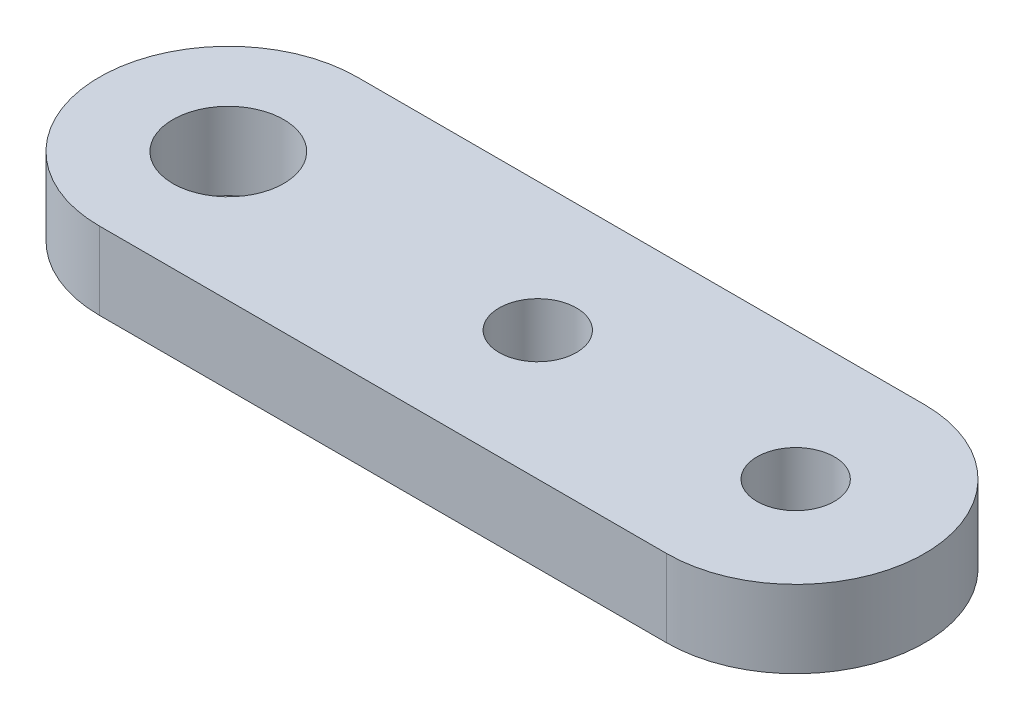
ISO-10303-21;
HEADER;
FILE_DESCRIPTION(('STEP AP214'),'2;1');
FILE_NAME('part.step','',(''),(''),'','','');
FILE_SCHEMA(('AUTOMOTIVE_DESIGN { 1 0 10303 214 1 1 1 1 }'));
ENDSEC;
DATA;
#1=APPLICATION_CONTEXT('core data for automotive mechanical design processes');
#2=APPLICATION_PROTOCOL_DEFINITION('international standard','automotive_design',2000,#1);
#3=PRODUCT_CONTEXT('',#1,'mechanical');
#4=PRODUCT('Part','Part','',(#3));
#5=PRODUCT_RELATED_PRODUCT_CATEGORY('part','',(#4));
#6=PRODUCT_DEFINITION_FORMATION('','',#4);
#7=PRODUCT_DEFINITION_CONTEXT('part definition',#1,'design');
#8=PRODUCT_DEFINITION('design','',#6,#7);
#9=PRODUCT_DEFINITION_SHAPE('','',#8);
#10=(LENGTH_UNIT() NAMED_UNIT(*) SI_UNIT(.MILLI.,.METRE.));
#11=(NAMED_UNIT(*) PLANE_ANGLE_UNIT() SI_UNIT($,.RADIAN.));
#12=(NAMED_UNIT(*) SI_UNIT($,.STERADIAN.) SOLID_ANGLE_UNIT());
#13=UNCERTAINTY_MEASURE_WITH_UNIT(LENGTH_MEASURE(1.E-05),#10,'distance_accuracy_value','');
#14=(GEOMETRIC_REPRESENTATION_CONTEXT(3) GLOBAL_UNCERTAINTY_ASSIGNED_CONTEXT((#13)) GLOBAL_UNIT_ASSIGNED_CONTEXT((#10,
#11,#12)) REPRESENTATION_CONTEXT('',''));
#15=CARTESIAN_POINT('',(0.,0.,0.));
#16=DIRECTION('',(0.,0.,1.));
#17=DIRECTION('',(1.,0.,0.));
#18=AXIS2_PLACEMENT_3D('',#15,#16,#17);
#19=CARTESIAN_POINT('',(-22.,3.,0.));
#20=DIRECTION('',(0.,1.,0.));
#21=DIRECTION('',(0.,0.,1.));
#22=AXIS2_PLACEMENT_3D('',#19,#20,#21);
#23=PLANE('',#22);
#24=CARTESIAN_POINT('',(-10.,3.,0.));
#25=DIRECTION('',(0.,1.,0.));
#26=DIRECTION('',(0.,0.,1.));
#27=AXIS2_PLACEMENT_3D('',#24,#25,#26);
#28=CIRCLE('',#27,1.5);
#29=CARTESIAN_POINT('',(-10.,3.,1.5));
#30=VERTEX_POINT('',#29);
#31=EDGE_CURVE('E118',#30,#30,#28,.T.);
#32=ORIENTED_EDGE('',*,*,#31,.F.);
#33=EDGE_LOOP('',(#32));
#34=FACE_BOUND('',#33,.T.);
#35=CARTESIAN_POINT('',(-22.,3.,0.));
#36=DIRECTION('',(0.,1.,0.));
#37=DIRECTION('',(0.,0.,1.));
#38=AXIS2_PLACEMENT_3D('',#35,#36,#37);
#39=CIRCLE('',#38,5.);
#40=CARTESIAN_POINT('',(-22.,3.,-5.));
#41=VERTEX_POINT('',#40);
#42=CARTESIAN_POINT('',(-22.,3.,5.));
#43=VERTEX_POINT('',#42);
#44=EDGE_CURVE('E88',#41,#43,#39,.T.);
#45=ORIENTED_EDGE('',*,*,#44,.T.);
#46=DIRECTION('',(1.,0.,0.));
#47=VECTOR('',#46,1.);
#48=CARTESIAN_POINT('',(-22.,3.,5.));
#49=LINE('',#48,#47);
#50=CARTESIAN_POINT('',(0.,3.,5.));
#51=VERTEX_POINT('',#50);
#52=EDGE_CURVE('E83',#43,#51,#49,.T.);
#53=ORIENTED_EDGE('',*,*,#52,.T.);
#54=CARTESIAN_POINT('',(0.,3.,0.));
#55=DIRECTION('',(0.,1.,0.));
#56=DIRECTION('',(0.,0.,1.));
#57=AXIS2_PLACEMENT_3D('',#54,#55,#56);
#58=CIRCLE('',#57,5.);
#59=CARTESIAN_POINT('',(0.,3.,-5.));
#60=VERTEX_POINT('',#59);
#61=EDGE_CURVE('E86',#51,#60,#58,.T.);
#62=ORIENTED_EDGE('',*,*,#61,.T.);
#63=DIRECTION('',(-1.,0.,0.));
#64=VECTOR('',#63,1.);
#65=CARTESIAN_POINT('',(-22.,3.,-5.));
#66=LINE('',#65,#64);
#67=EDGE_CURVE('E53',#60,#41,#66,.T.);
#68=ORIENTED_EDGE('',*,*,#67,.T.);
#69=EDGE_LOOP('',(#45,#53,#62,#68));
#70=FACE_BOUND('',#69,.T.);
#71=CARTESIAN_POINT('',(0.,3.,0.));
#72=DIRECTION('',(0.,1.,0.));
#73=DIRECTION('',(0.,0.,1.));
#74=AXIS2_PLACEMENT_3D('',#71,#72,#73);
#75=CIRCLE('',#74,1.5);
#76=CARTESIAN_POINT('',(0.,3.,1.5));
#77=VERTEX_POINT('',#76);
#78=EDGE_CURVE('E103',#77,#77,#75,.T.);
#79=ORIENTED_EDGE('',*,*,#78,.F.);
#80=EDGE_LOOP('',(#79));
#81=FACE_BOUND('',#80,.T.);
#82=CARTESIAN_POINT('',(-22.,3.,0.));
#83=DIRECTION('',(0.,1.,0.));
#84=DIRECTION('',(0.,0.,1.));
#85=AXIS2_PLACEMENT_3D('',#82,#83,#84);
#86=CIRCLE('',#85,2.15);
#87=CARTESIAN_POINT('',(-22.,3.,2.15));
#88=VERTEX_POINT('',#87);
#89=EDGE_CURVE('E124',#88,#88,#86,.T.);
#90=ORIENTED_EDGE('',*,*,#89,.F.);
#91=EDGE_LOOP('',(#90));
#92=FACE_BOUND('',#91,.T.);
#93=ADVANCED_FACE('F36',(#34,#70,#81,#92),#23,.T.);
#94=CARTESIAN_POINT('',(-22.,0.,0.));
#95=DIRECTION('',(0.,1.,0.));
#96=DIRECTION('',(0.,0.,1.));
#97=AXIS2_PLACEMENT_3D('',#94,#95,#96);
#98=PLANE('',#97);
#99=CARTESIAN_POINT('',(-22.,0.,0.));
#100=DIRECTION('',(0.,1.,0.));
#101=DIRECTION('',(0.,0.,1.));
#102=AXIS2_PLACEMENT_3D('',#99,#100,#101);
#103=CIRCLE('',#102,5.);
#104=CARTESIAN_POINT('',(-22.,0.,-5.));
#105=VERTEX_POINT('',#104);
#106=CARTESIAN_POINT('',(-22.,0.,5.));
#107=VERTEX_POINT('',#106);
#108=EDGE_CURVE('E100',#105,#107,#103,.T.);
#109=ORIENTED_EDGE('',*,*,#108,.F.);
#110=DIRECTION('',(-1.,0.,0.));
#111=VECTOR('',#110,1.);
#112=CARTESIAN_POINT('',(-22.,0.,-5.));
#113=LINE('',#112,#111);
#114=CARTESIAN_POINT('',(0.,0.,-5.));
#115=VERTEX_POINT('',#114);
#116=EDGE_CURVE('E76',#115,#105,#113,.T.);
#117=ORIENTED_EDGE('',*,*,#116,.F.);
#118=CARTESIAN_POINT('',(0.,0.,0.));
#119=DIRECTION('',(0.,1.,0.));
#120=DIRECTION('',(0.,0.,1.));
#121=AXIS2_PLACEMENT_3D('',#118,#119,#120);
#122=CIRCLE('',#121,5.);
#123=CARTESIAN_POINT('',(0.,0.,5.));
#124=VERTEX_POINT('',#123);
#125=EDGE_CURVE('E70',#124,#115,#122,.T.);
#126=ORIENTED_EDGE('',*,*,#125,.F.);
#127=DIRECTION('',(1.,0.,0.));
#128=VECTOR('',#127,1.);
#129=CARTESIAN_POINT('',(-22.,0.,5.));
#130=LINE('',#129,#128);
#131=EDGE_CURVE('E92',#107,#124,#130,.T.);
#132=ORIENTED_EDGE('',*,*,#131,.F.);
#133=EDGE_LOOP('',(#109,#117,#126,#132));
#134=FACE_BOUND('',#133,.T.);
#135=CARTESIAN_POINT('',(0.,0.,0.));
#136=DIRECTION('',(0.,1.,0.));
#137=DIRECTION('',(0.,0.,1.));
#138=AXIS2_PLACEMENT_3D('',#135,#136,#137);
#139=CIRCLE('',#138,1.5);
#140=CARTESIAN_POINT('',(0.,0.,1.5));
#141=VERTEX_POINT('',#140);
#142=EDGE_CURVE('E115',#141,#141,#139,.T.);
#143=ORIENTED_EDGE('',*,*,#142,.T.);
#144=EDGE_LOOP('',(#143));
#145=FACE_BOUND('',#144,.T.);
#146=CARTESIAN_POINT('',(-10.,0.,0.));
#147=DIRECTION('',(0.,1.,0.));
#148=DIRECTION('',(0.,0.,1.));
#149=AXIS2_PLACEMENT_3D('',#146,#147,#148);
#150=CIRCLE('',#149,1.5);
#151=CARTESIAN_POINT('',(-10.,0.,1.5));
#152=VERTEX_POINT('',#151);
#153=EDGE_CURVE('E121',#152,#152,#150,.T.);
#154=ORIENTED_EDGE('',*,*,#153,.T.);
#155=EDGE_LOOP('',(#154));
#156=FACE_BOUND('',#155,.T.);
#157=CARTESIAN_POINT('',(-22.,0.,0.));
#158=DIRECTION('',(0.,1.,0.));
#159=DIRECTION('',(0.,0.,1.));
#160=AXIS2_PLACEMENT_3D('',#157,#158,#159);
#161=CIRCLE('',#160,2.15);
#162=CARTESIAN_POINT('',(-22.,0.,2.15));
#163=VERTEX_POINT('',#162);
#164=EDGE_CURVE('E127',#163,#163,#161,.T.);
#165=ORIENTED_EDGE('',*,*,#164,.T.);
#166=EDGE_LOOP('',(#165));
#167=FACE_BOUND('',#166,.T.);
#168=ADVANCED_FACE('F111',(#134,#145,#156,#167),#98,.F.);
#169=CARTESIAN_POINT('',(-22.,3.,0.));
#170=DIRECTION('',(0.,-1.,0.));
#171=DIRECTION('',(0.,0.,-1.));
#172=AXIS2_PLACEMENT_3D('',#169,#170,#171);
#173=CYLINDRICAL_SURFACE('',#172,5.);
#174=ORIENTED_EDGE('',*,*,#108,.T.);
#175=DIRECTION('',(0.,-1.,0.));
#176=VECTOR('',#175,1.);
#177=CARTESIAN_POINT('',(-22.,3.,5.));
#178=LINE('',#177,#176);
#179=EDGE_CURVE('E11',#43,#107,#178,.T.);
#180=ORIENTED_EDGE('',*,*,#179,.F.);
#181=ORIENTED_EDGE('',*,*,#44,.F.);
#182=DIRECTION('',(0.,-1.,0.));
#183=VECTOR('',#182,1.);
#184=CARTESIAN_POINT('',(-22.,3.,-5.));
#185=LINE('',#184,#183);
#186=EDGE_CURVE('E96',#41,#105,#185,.T.);
#187=ORIENTED_EDGE('',*,*,#186,.T.);
#188=EDGE_LOOP('',(#174,#180,#181,#187));
#189=FACE_BOUND('',#188,.T.);
#190=ADVANCED_FACE('F38',(#189),#173,.T.);
#191=CARTESIAN_POINT('',(-22.,3.,5.));
#192=DIRECTION('',(0.,0.,-1.));
#193=DIRECTION('',(-1.,0.,0.));
#194=AXIS2_PLACEMENT_3D('',#191,#192,#193);
#195=PLANE('',#194);
#196=ORIENTED_EDGE('',*,*,#131,.T.);
#197=DIRECTION('',(0.,-1.,0.));
#198=VECTOR('',#197,1.);
#199=CARTESIAN_POINT('',(0.,3.,5.));
#200=LINE('',#199,#198);
#201=EDGE_CURVE('E45',#51,#124,#200,.T.);
#202=ORIENTED_EDGE('',*,*,#201,.F.);
#203=ORIENTED_EDGE('',*,*,#52,.F.);
#204=ORIENTED_EDGE('',*,*,#179,.T.);
#205=EDGE_LOOP('',(#196,#202,#203,#204));
#206=FACE_BOUND('',#205,.T.);
#207=ADVANCED_FACE('F91',(#206),#195,.F.);
#208=CARTESIAN_POINT('',(0.,3.,0.));
#209=DIRECTION('',(0.,-1.,0.));
#210=DIRECTION('',(0.,0.,-1.));
#211=AXIS2_PLACEMENT_3D('',#208,#209,#210);
#212=CYLINDRICAL_SURFACE('',#211,5.);
#213=ORIENTED_EDGE('',*,*,#125,.T.);
#214=DIRECTION('',(0.,-1.,0.));
#215=VECTOR('',#214,1.);
#216=CARTESIAN_POINT('',(0.,3.,-5.));
#217=LINE('',#216,#215);
#218=EDGE_CURVE('E93',#60,#115,#217,.T.);
#219=ORIENTED_EDGE('',*,*,#218,.F.);
#220=ORIENTED_EDGE('',*,*,#61,.F.);
#221=ORIENTED_EDGE('',*,*,#201,.T.);
#222=EDGE_LOOP('',(#213,#219,#220,#221));
#223=FACE_BOUND('',#222,.T.);
#224=ADVANCED_FACE('F94',(#223),#212,.T.);
#225=CARTESIAN_POINT('',(-22.,3.,-5.));
#226=DIRECTION('',(0.,0.,1.));
#227=DIRECTION('',(1.,0.,0.));
#228=AXIS2_PLACEMENT_3D('',#225,#226,#227);
#229=PLANE('',#228);
#230=ORIENTED_EDGE('',*,*,#116,.T.);
#231=ORIENTED_EDGE('',*,*,#186,.F.);
#232=ORIENTED_EDGE('',*,*,#67,.F.);
#233=ORIENTED_EDGE('',*,*,#218,.T.);
#234=EDGE_LOOP('',(#230,#231,#232,#233));
#235=FACE_BOUND('',#234,.T.);
#236=ADVANCED_FACE('F108',(#235),#229,.F.);
#237=CARTESIAN_POINT('',(0.,3.,0.));
#238=DIRECTION('',(0.,-1.,0.));
#239=DIRECTION('',(0.,0.,-1.));
#240=AXIS2_PLACEMENT_3D('',#237,#238,#239);
#241=CYLINDRICAL_SURFACE('',#240,1.5);
#242=ORIENTED_EDGE('',*,*,#78,.T.);
#243=EDGE_LOOP('',(#242));
#244=FACE_BOUND('',#243,.T.);
#245=ORIENTED_EDGE('',*,*,#142,.F.);
#246=EDGE_LOOP('',(#245));
#247=FACE_BOUND('',#246,.T.);
#248=ADVANCED_FACE('F145',(#244,#247),#241,.F.);
#249=CARTESIAN_POINT('',(-10.,3.,0.));
#250=DIRECTION('',(0.,-1.,0.));
#251=DIRECTION('',(0.,0.,-1.));
#252=AXIS2_PLACEMENT_3D('',#249,#250,#251);
#253=CYLINDRICAL_SURFACE('',#252,1.5);
#254=ORIENTED_EDGE('',*,*,#31,.T.);
#255=EDGE_LOOP('',(#254));
#256=FACE_BOUND('',#255,.T.);
#257=ORIENTED_EDGE('',*,*,#153,.F.);
#258=EDGE_LOOP('',(#257));
#259=FACE_BOUND('',#258,.T.);
#260=ADVANCED_FACE('F191',(#256,#259),#253,.F.);
#261=CARTESIAN_POINT('',(-22.,3.,0.));
#262=DIRECTION('',(0.,-1.,0.));
#263=DIRECTION('',(0.,0.,-1.));
#264=AXIS2_PLACEMENT_3D('',#261,#262,#263);
#265=CYLINDRICAL_SURFACE('',#264,2.15);
#266=ORIENTED_EDGE('',*,*,#89,.T.);
#267=EDGE_LOOP('',(#266));
#268=FACE_BOUND('',#267,.T.);
#269=ORIENTED_EDGE('',*,*,#164,.F.);
#270=EDGE_LOOP('',(#269));
#271=FACE_BOUND('',#270,.T.);
#272=ADVANCED_FACE('F133',(#268,#271),#265,.F.);
#273=CLOSED_SHELL('',(#93,#168,#190,#207,#224,#236,#248,#260,#272));
#274=MANIFOLD_SOLID_BREP('B2',#273);
#275=ADVANCED_BREP_SHAPE_REPRESENTATION('',(#18,#274),#14);
#276=SHAPE_DEFINITION_REPRESENTATION(#9,#275);
ENDSEC;
END-ISO-10303-21;
